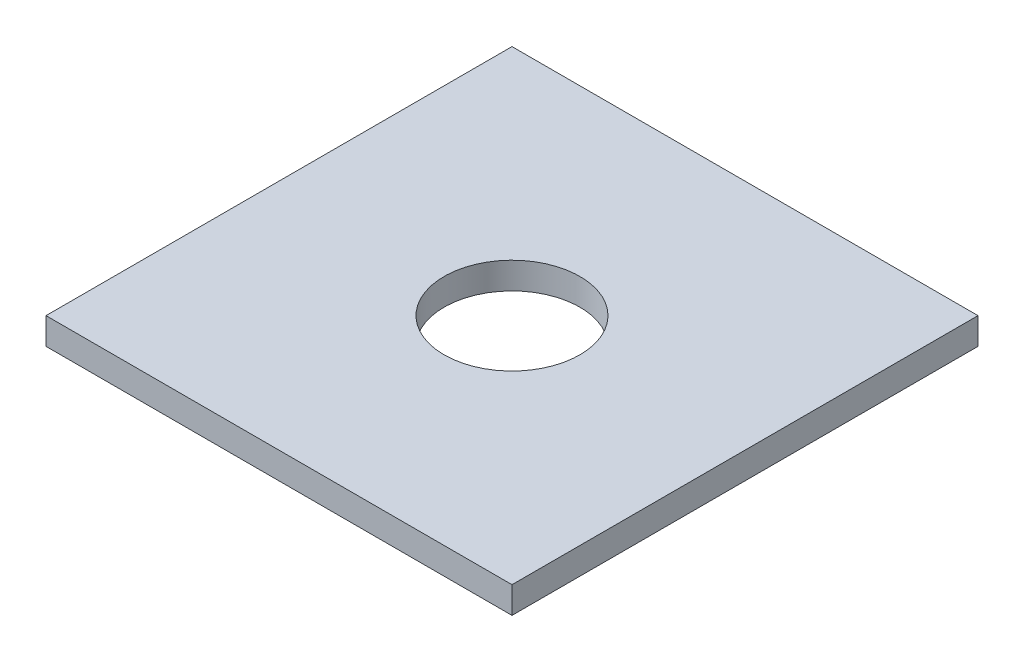
ISO-10303-21;
HEADER;
FILE_DESCRIPTION(('STEP AP214'),'2;1');
FILE_NAME('part.step','',(''),(''),'','','');
FILE_SCHEMA(('AUTOMOTIVE_DESIGN { 1 0 10303 214 1 1 1 1 }'));
ENDSEC;
DATA;
#1=APPLICATION_CONTEXT('core data for automotive mechanical design processes');
#2=APPLICATION_PROTOCOL_DEFINITION('international standard','automotive_design',2000,#1);
#3=PRODUCT_CONTEXT('',#1,'mechanical');
#4=PRODUCT('Part','Part','',(#3));
#5=PRODUCT_RELATED_PRODUCT_CATEGORY('part','',(#4));
#6=PRODUCT_DEFINITION_FORMATION('','',#4);
#7=PRODUCT_DEFINITION_CONTEXT('part definition',#1,'design');
#8=PRODUCT_DEFINITION('design','',#6,#7);
#9=PRODUCT_DEFINITION_SHAPE('','',#8);
#10=(LENGTH_UNIT() NAMED_UNIT(*) SI_UNIT(.MILLI.,.METRE.));
#11=(NAMED_UNIT(*) PLANE_ANGLE_UNIT() SI_UNIT($,.RADIAN.));
#12=(NAMED_UNIT(*) SI_UNIT($,.STERADIAN.) SOLID_ANGLE_UNIT());
#13=UNCERTAINTY_MEASURE_WITH_UNIT(LENGTH_MEASURE(1.E-05),#10,'distance_accuracy_value','');
#14=(GEOMETRIC_REPRESENTATION_CONTEXT(3) GLOBAL_UNCERTAINTY_ASSIGNED_CONTEXT((#13)) GLOBAL_UNIT_ASSIGNED_CONTEXT((#10,
#11,#12)) REPRESENTATION_CONTEXT('',''));
#15=CARTESIAN_POINT('',(0.,0.,0.));
#16=DIRECTION('',(0.,0.,1.));
#17=DIRECTION('',(1.,0.,0.));
#18=AXIS2_PLACEMENT_3D('',#15,#16,#17);
#19=CARTESIAN_POINT('',(17.5,2.,-17.5));
#20=DIRECTION('',(-1.,0.,0.));
#21=DIRECTION('',(0.,0.,1.));
#22=AXIS2_PLACEMENT_3D('',#19,#20,#21);
#23=PLANE('',#22);
#24=DIRECTION('',(0.,0.,-1.));
#25=VECTOR('',#24,1.);
#26=CARTESIAN_POINT('',(17.5,0.,-17.5));
#27=LINE('',#26,#25);
#28=CARTESIAN_POINT('',(17.5,0.,17.5));
#29=VERTEX_POINT('',#28);
#30=CARTESIAN_POINT('',(17.5,0.,-17.5));
#31=VERTEX_POINT('',#30);
#32=EDGE_CURVE('E102',#29,#31,#27,.T.);
#33=ORIENTED_EDGE('',*,*,#32,.T.);
#34=DIRECTION('',(0.,-1.,0.));
#35=VECTOR('',#34,1.);
#36=CARTESIAN_POINT('',(17.5,2.,-17.5));
#37=LINE('',#36,#35);
#38=CARTESIAN_POINT('',(17.5,2.,-17.5));
#39=VERTEX_POINT('',#38);
#40=EDGE_CURVE('E11',#39,#31,#37,.T.);
#41=ORIENTED_EDGE('',*,*,#40,.F.);
#42=DIRECTION('',(0.,0.,-1.));
#43=VECTOR('',#42,1.);
#44=CARTESIAN_POINT('',(17.5,2.,-17.5));
#45=LINE('',#44,#43);
#46=CARTESIAN_POINT('',(17.5,2.,17.5));
#47=VERTEX_POINT('',#46);
#48=EDGE_CURVE('E90',#47,#39,#45,.T.);
#49=ORIENTED_EDGE('',*,*,#48,.F.);
#50=DIRECTION('',(0.,-1.,0.));
#51=VECTOR('',#50,1.);
#52=CARTESIAN_POINT('',(17.5,2.,17.5));
#53=LINE('',#52,#51);
#54=EDGE_CURVE('E98',#47,#29,#53,.T.);
#55=ORIENTED_EDGE('',*,*,#54,.T.);
#56=EDGE_LOOP('',(#33,#41,#49,#55));
#57=FACE_BOUND('',#56,.T.);
#58=ADVANCED_FACE('F39',(#57),#23,.F.);
#59=CARTESIAN_POINT('',(-17.5,2.,-17.5));
#60=DIRECTION('',(0.,0.,1.));
#61=DIRECTION('',(1.,0.,0.));
#62=AXIS2_PLACEMENT_3D('',#59,#60,#61);
#63=PLANE('',#62);
#64=DIRECTION('',(-1.,0.,0.));
#65=VECTOR('',#64,1.);
#66=CARTESIAN_POINT('',(-17.5,0.,-17.5));
#67=LINE('',#66,#65);
#68=CARTESIAN_POINT('',(-17.5,0.,-17.5));
#69=VERTEX_POINT('',#68);
#70=EDGE_CURVE('E94',#31,#69,#67,.T.);
#71=ORIENTED_EDGE('',*,*,#70,.T.);
#72=DIRECTION('',(0.,-1.,0.));
#73=VECTOR('',#72,1.);
#74=CARTESIAN_POINT('',(-17.5,2.,-17.5));
#75=LINE('',#74,#73);
#76=CARTESIAN_POINT('',(-17.5,2.,-17.5));
#77=VERTEX_POINT('',#76);
#78=EDGE_CURVE('E47',#77,#69,#75,.T.);
#79=ORIENTED_EDGE('',*,*,#78,.F.);
#80=DIRECTION('',(-1.,0.,0.));
#81=VECTOR('',#80,1.);
#82=CARTESIAN_POINT('',(-17.5,2.,-17.5));
#83=LINE('',#82,#81);
#84=EDGE_CURVE('E85',#39,#77,#83,.T.);
#85=ORIENTED_EDGE('',*,*,#84,.F.);
#86=ORIENTED_EDGE('',*,*,#40,.T.);
#87=EDGE_LOOP('',(#71,#79,#85,#86));
#88=FACE_BOUND('',#87,.T.);
#89=ADVANCED_FACE('F93',(#88),#63,.F.);
#90=CARTESIAN_POINT('',(-17.5,2.,-17.5));
#91=DIRECTION('',(1.,0.,0.));
#92=DIRECTION('',(0.,0.,-1.));
#93=AXIS2_PLACEMENT_3D('',#90,#91,#92);
#94=PLANE('',#93);
#95=DIRECTION('',(0.,0.,1.));
#96=VECTOR('',#95,1.);
#97=CARTESIAN_POINT('',(-17.5,0.,-17.5));
#98=LINE('',#97,#96);
#99=CARTESIAN_POINT('',(-17.5,0.,17.5));
#100=VERTEX_POINT('',#99);
#101=EDGE_CURVE('E72',#69,#100,#98,.T.);
#102=ORIENTED_EDGE('',*,*,#101,.T.);
#103=DIRECTION('',(0.,-1.,0.));
#104=VECTOR('',#103,1.);
#105=CARTESIAN_POINT('',(-17.5,2.,17.5));
#106=LINE('',#105,#104);
#107=CARTESIAN_POINT('',(-17.5,2.,17.5));
#108=VERTEX_POINT('',#107);
#109=EDGE_CURVE('E95',#108,#100,#106,.T.);
#110=ORIENTED_EDGE('',*,*,#109,.F.);
#111=DIRECTION('',(0.,0.,1.));
#112=VECTOR('',#111,1.);
#113=CARTESIAN_POINT('',(-17.5,2.,-17.5));
#114=LINE('',#113,#112);
#115=EDGE_CURVE('E88',#77,#108,#114,.T.);
#116=ORIENTED_EDGE('',*,*,#115,.F.);
#117=ORIENTED_EDGE('',*,*,#78,.T.);
#118=EDGE_LOOP('',(#102,#110,#116,#117));
#119=FACE_BOUND('',#118,.T.);
#120=ADVANCED_FACE('F96',(#119),#94,.F.);
#121=CARTESIAN_POINT('',(-17.5,2.,17.5));
#122=DIRECTION('',(0.,0.,-1.));
#123=DIRECTION('',(-1.,0.,0.));
#124=AXIS2_PLACEMENT_3D('',#121,#122,#123);
#125=PLANE('',#124);
#126=DIRECTION('',(1.,0.,0.));
#127=VECTOR('',#126,1.);
#128=CARTESIAN_POINT('',(-17.5,0.,17.5));
#129=LINE('',#128,#127);
#130=EDGE_CURVE('E78',#100,#29,#129,.T.);
#131=ORIENTED_EDGE('',*,*,#130,.T.);
#132=ORIENTED_EDGE('',*,*,#54,.F.);
#133=DIRECTION('',(1.,0.,0.));
#134=VECTOR('',#133,1.);
#135=CARTESIAN_POINT('',(-17.5,2.,17.5));
#136=LINE('',#135,#134);
#137=EDGE_CURVE('E55',#108,#47,#136,.T.);
#138=ORIENTED_EDGE('',*,*,#137,.F.);
#139=ORIENTED_EDGE('',*,*,#109,.T.);
#140=EDGE_LOOP('',(#131,#132,#138,#139));
#141=FACE_BOUND('',#140,.T.);
#142=ADVANCED_FACE('F110',(#141),#125,.F.);
#143=CARTESIAN_POINT('',(0.,2.,0.));
#144=DIRECTION('',(0.,1.,0.));
#145=DIRECTION('',(0.,0.,1.));
#146=AXIS2_PLACEMENT_3D('',#143,#144,#145);
#147=PLANE('',#146);
#148=CARTESIAN_POINT('',(0.,2.,0.));
#149=DIRECTION('',(0.,1.,0.));
#150=DIRECTION('',(0.,0.,1.));
#151=AXIS2_PLACEMENT_3D('',#148,#149,#150);
#152=CIRCLE('',#151,5.1);
#153=CARTESIAN_POINT('',(0.,2.,5.1));
#154=VERTEX_POINT('',#153);
#155=EDGE_CURVE('E116',#154,#154,#152,.T.);
#156=ORIENTED_EDGE('',*,*,#155,.F.);
#157=EDGE_LOOP('',(#156));
#158=FACE_BOUND('',#157,.T.);
#159=ORIENTED_EDGE('',*,*,#48,.T.);
#160=ORIENTED_EDGE('',*,*,#84,.T.);
#161=ORIENTED_EDGE('',*,*,#115,.T.);
#162=ORIENTED_EDGE('',*,*,#137,.T.);
#163=EDGE_LOOP('',(#159,#160,#161,#162));
#164=FACE_BOUND('',#163,.T.);
#165=ADVANCED_FACE('F86',(#158,#164),#147,.T.);
#166=CARTESIAN_POINT('',(0.,0.,0.));
#167=DIRECTION('',(0.,1.,0.));
#168=DIRECTION('',(0.,0.,1.));
#169=AXIS2_PLACEMENT_3D('',#166,#167,#168);
#170=PLANE('',#169);
#171=CARTESIAN_POINT('',(0.,0.,0.));
#172=DIRECTION('',(0.,1.,0.));
#173=DIRECTION('',(0.,0.,1.));
#174=AXIS2_PLACEMENT_3D('',#171,#172,#173);
#175=CIRCLE('',#174,5.1);
#176=CARTESIAN_POINT('',(0.,0.,5.1));
#177=VERTEX_POINT('',#176);
#178=EDGE_CURVE('E105',#177,#177,#175,.T.);
#179=ORIENTED_EDGE('',*,*,#178,.T.);
#180=EDGE_LOOP('',(#179));
#181=FACE_BOUND('',#180,.T.);
#182=ORIENTED_EDGE('',*,*,#32,.F.);
#183=ORIENTED_EDGE('',*,*,#130,.F.);
#184=ORIENTED_EDGE('',*,*,#101,.F.);
#185=ORIENTED_EDGE('',*,*,#70,.F.);
#186=EDGE_LOOP('',(#182,#183,#184,#185));
#187=FACE_BOUND('',#186,.T.);
#188=ADVANCED_FACE('F113',(#181,#187),#170,.F.);
#189=CARTESIAN_POINT('',(0.,0.,0.));
#190=DIRECTION('',(0.,1.,0.));
#191=DIRECTION('',(0.,0.,1.));
#192=AXIS2_PLACEMENT_3D('',#189,#190,#191);
#193=CYLINDRICAL_SURFACE('',#192,5.1);
#194=ORIENTED_EDGE('',*,*,#178,.F.);
#195=EDGE_LOOP('',(#194));
#196=FACE_BOUND('',#195,.T.);
#197=ORIENTED_EDGE('',*,*,#155,.T.);
#198=EDGE_LOOP('',(#197));
#199=FACE_BOUND('',#198,.T.);
#200=ADVANCED_FACE('F123',(#196,#199),#193,.F.);
#201=CLOSED_SHELL('',(#58,#89,#120,#142,#165,#188,#200));
#202=MANIFOLD_SOLID_BREP('B2',#201);
#203=ADVANCED_BREP_SHAPE_REPRESENTATION('',(#18,#202),#14);
#204=SHAPE_DEFINITION_REPRESENTATION(#9,#203);
ENDSEC;
END-ISO-10303-21;
